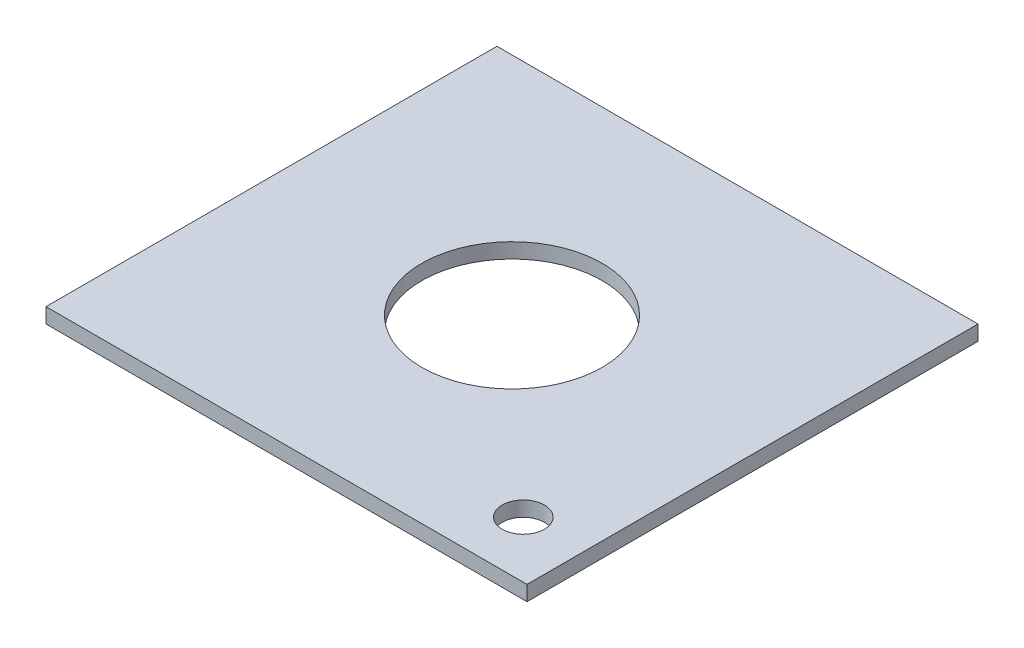
ISO-10303-21;
HEADER;
FILE_DESCRIPTION(('STEP AP214'),'2;1');
FILE_NAME('part.step','',(''),(''),'','','');
FILE_SCHEMA(('AUTOMOTIVE_DESIGN { 1 0 10303 214 1 1 1 1 }'));
ENDSEC;
DATA;
#1=APPLICATION_CONTEXT('core data for automotive mechanical design processes');
#2=APPLICATION_PROTOCOL_DEFINITION('international standard','automotive_design',2000,#1);
#3=PRODUCT_CONTEXT('',#1,'mechanical');
#4=PRODUCT('Part','Part','',(#3));
#5=PRODUCT_RELATED_PRODUCT_CATEGORY('part','',(#4));
#6=PRODUCT_DEFINITION_FORMATION('','',#4);
#7=PRODUCT_DEFINITION_CONTEXT('part definition',#1,'design');
#8=PRODUCT_DEFINITION('design','',#6,#7);
#9=PRODUCT_DEFINITION_SHAPE('','',#8);
#10=(LENGTH_UNIT() NAMED_UNIT(*) SI_UNIT(.MILLI.,.METRE.));
#11=(NAMED_UNIT(*) PLANE_ANGLE_UNIT() SI_UNIT($,.RADIAN.));
#12=(NAMED_UNIT(*) SI_UNIT($,.STERADIAN.) SOLID_ANGLE_UNIT());
#13=UNCERTAINTY_MEASURE_WITH_UNIT(LENGTH_MEASURE(1.E-05),#10,'distance_accuracy_value','');
#14=(GEOMETRIC_REPRESENTATION_CONTEXT(3) GLOBAL_UNCERTAINTY_ASSIGNED_CONTEXT((#13)) GLOBAL_UNIT_ASSIGNED_CONTEXT((#10,
#11,#12)) REPRESENTATION_CONTEXT('',''));
#15=CARTESIAN_POINT('',(0.,0.,0.));
#16=DIRECTION('',(0.,0.,1.));
#17=DIRECTION('',(1.,0.,0.));
#18=AXIS2_PLACEMENT_3D('',#15,#16,#17);
#19=CARTESIAN_POINT('',(0.,2.5,0.));
#20=DIRECTION('',(0.,1.,0.));
#21=DIRECTION('',(0.,0.,1.));
#22=AXIS2_PLACEMENT_3D('',#19,#20,#21);
#23=PLANE('',#22);
#24=CARTESIAN_POINT('',(0.,2.5,0.));
#25=DIRECTION('',(0.,1.,0.));
#26=DIRECTION('',(0.,0.,1.));
#27=AXIS2_PLACEMENT_3D('',#24,#25,#26);
#28=CIRCLE('',#27,15.);
#29=CARTESIAN_POINT('',(0.,2.5,15.));
#30=VERTEX_POINT('',#29);
#31=EDGE_CURVE('E100',#30,#30,#28,.T.);
#32=ORIENTED_EDGE('',*,*,#31,.F.);
#33=EDGE_LOOP('',(#32));
#34=FACE_BOUND('',#33,.T.);
#35=DIRECTION('',(0.,0.,-1.));
#36=VECTOR('',#35,1.);
#37=CARTESIAN_POINT('',(40.,2.5,-37.5));
#38=LINE('',#37,#36);
#39=CARTESIAN_POINT('',(40.,2.5,37.5));
#40=VERTEX_POINT('',#39);
#41=CARTESIAN_POINT('',(40.,2.5,-37.5));
#42=VERTEX_POINT('',#41);
#43=EDGE_CURVE('E85',#40,#42,#38,.T.);
#44=ORIENTED_EDGE('',*,*,#43,.T.);
#45=DIRECTION('',(-1.,0.,0.));
#46=VECTOR('',#45,1.);
#47=CARTESIAN_POINT('',(-40.,2.5,-37.5));
#48=LINE('',#47,#46);
#49=CARTESIAN_POINT('',(-40.,2.5,-37.5));
#50=VERTEX_POINT('',#49);
#51=EDGE_CURVE('E80',#42,#50,#48,.T.);
#52=ORIENTED_EDGE('',*,*,#51,.T.);
#53=DIRECTION('',(0.,0.,1.));
#54=VECTOR('',#53,1.);
#55=CARTESIAN_POINT('',(-40.,2.5,-37.5));
#56=LINE('',#55,#54);
#57=CARTESIAN_POINT('',(-40.,2.5,37.5));
#58=VERTEX_POINT('',#57);
#59=EDGE_CURVE('E83',#50,#58,#56,.T.);
#60=ORIENTED_EDGE('',*,*,#59,.T.);
#61=DIRECTION('',(1.,0.,0.));
#62=VECTOR('',#61,1.);
#63=CARTESIAN_POINT('',(-40.,2.5,37.5));
#64=LINE('',#63,#62);
#65=EDGE_CURVE('E50',#58,#40,#64,.T.);
#66=ORIENTED_EDGE('',*,*,#65,.T.);
#67=EDGE_LOOP('',(#44,#52,#60,#66));
#68=FACE_BOUND('',#67,.T.);
#69=CARTESIAN_POINT('',(30.,2.5,28.125));
#70=DIRECTION('',(0.,1.,0.));
#71=DIRECTION('',(0.,0.,1.));
#72=AXIS2_PLACEMENT_3D('',#69,#70,#71);
#73=CIRCLE('',#72,3.5);
#74=CARTESIAN_POINT('',(30.,2.5,31.625));
#75=VERTEX_POINT('',#74);
#76=EDGE_CURVE('E115',#75,#75,#73,.T.);
#77=ORIENTED_EDGE('',*,*,#76,.F.);
#78=EDGE_LOOP('',(#77));
#79=FACE_BOUND('',#78,.T.);
#80=ADVANCED_FACE('F33',(#34,#68,#79),#23,.T.);
#81=CARTESIAN_POINT('',(0.,0.,0.));
#82=DIRECTION('',(0.,1.,0.));
#83=DIRECTION('',(0.,0.,1.));
#84=AXIS2_PLACEMENT_3D('',#81,#82,#83);
#85=PLANE('',#84);
#86=DIRECTION('',(0.,0.,-1.));
#87=VECTOR('',#86,1.);
#88=CARTESIAN_POINT('',(40.,0.,-37.5));
#89=LINE('',#88,#87);
#90=CARTESIAN_POINT('',(40.,0.,37.5));
#91=VERTEX_POINT('',#90);
#92=CARTESIAN_POINT('',(40.,0.,-37.5));
#93=VERTEX_POINT('',#92);
#94=EDGE_CURVE('E97',#91,#93,#89,.T.);
#95=ORIENTED_EDGE('',*,*,#94,.F.);
#96=DIRECTION('',(1.,0.,0.));
#97=VECTOR('',#96,1.);
#98=CARTESIAN_POINT('',(-40.,0.,37.5));
#99=LINE('',#98,#97);
#100=CARTESIAN_POINT('',(-40.,0.,37.5));
#101=VERTEX_POINT('',#100);
#102=EDGE_CURVE('E73',#101,#91,#99,.T.);
#103=ORIENTED_EDGE('',*,*,#102,.F.);
#104=DIRECTION('',(0.,0.,1.));
#105=VECTOR('',#104,1.);
#106=CARTESIAN_POINT('',(-40.,0.,-37.5));
#107=LINE('',#106,#105);
#108=CARTESIAN_POINT('',(-40.,0.,-37.5));
#109=VERTEX_POINT('',#108);
#110=EDGE_CURVE('E67',#109,#101,#107,.T.);
#111=ORIENTED_EDGE('',*,*,#110,.F.);
#112=DIRECTION('',(-1.,0.,0.));
#113=VECTOR('',#112,1.);
#114=CARTESIAN_POINT('',(-40.,0.,-37.5));
#115=LINE('',#114,#113);
#116=EDGE_CURVE('E89',#93,#109,#115,.T.);
#117=ORIENTED_EDGE('',*,*,#116,.F.);
#118=EDGE_LOOP('',(#95,#103,#111,#117));
#119=FACE_BOUND('',#118,.T.);
#120=CARTESIAN_POINT('',(0.,0.,0.));
#121=DIRECTION('',(0.,1.,0.));
#122=DIRECTION('',(0.,0.,1.));
#123=AXIS2_PLACEMENT_3D('',#120,#121,#122);
#124=CIRCLE('',#123,15.);
#125=CARTESIAN_POINT('',(0.,0.,15.));
#126=VERTEX_POINT('',#125);
#127=EDGE_CURVE('E112',#126,#126,#124,.T.);
#128=ORIENTED_EDGE('',*,*,#127,.T.);
#129=EDGE_LOOP('',(#128));
#130=FACE_BOUND('',#129,.T.);
#131=CARTESIAN_POINT('',(30.,0.,28.125));
#132=DIRECTION('',(0.,1.,0.));
#133=DIRECTION('',(0.,0.,1.));
#134=AXIS2_PLACEMENT_3D('',#131,#132,#133);
#135=CIRCLE('',#134,3.5);
#136=CARTESIAN_POINT('',(30.,0.,31.625));
#137=VERTEX_POINT('',#136);
#138=EDGE_CURVE('E118',#137,#137,#135,.T.);
#139=ORIENTED_EDGE('',*,*,#138,.T.);
#140=EDGE_LOOP('',(#139));
#141=FACE_BOUND('',#140,.T.);
#142=ADVANCED_FACE('F108',(#119,#130,#141),#85,.F.);
#143=CARTESIAN_POINT('',(40.,2.5,-37.5));
#144=DIRECTION('',(-1.,0.,0.));
#145=DIRECTION('',(0.,0.,1.));
#146=AXIS2_PLACEMENT_3D('',#143,#144,#145);
#147=PLANE('',#146);
#148=ORIENTED_EDGE('',*,*,#94,.T.);
#149=DIRECTION('',(0.,-1.,0.));
#150=VECTOR('',#149,1.);
#151=CARTESIAN_POINT('',(40.,2.5,-37.5));
#152=LINE('',#151,#150);
#153=EDGE_CURVE('E11',#42,#93,#152,.T.);
#154=ORIENTED_EDGE('',*,*,#153,.F.);
#155=ORIENTED_EDGE('',*,*,#43,.F.);
#156=DIRECTION('',(0.,-1.,0.));
#157=VECTOR('',#156,1.);
#158=CARTESIAN_POINT('',(40.,2.5,37.5));
#159=LINE('',#158,#157);
#160=EDGE_CURVE('E93',#40,#91,#159,.T.);
#161=ORIENTED_EDGE('',*,*,#160,.T.);
#162=EDGE_LOOP('',(#148,#154,#155,#161));
#163=FACE_BOUND('',#162,.T.);
#164=ADVANCED_FACE('F35',(#163),#147,.F.);
#165=CARTESIAN_POINT('',(-40.,2.5,-37.5));
#166=DIRECTION('',(0.,0.,1.));
#167=DIRECTION('',(1.,0.,0.));
#168=AXIS2_PLACEMENT_3D('',#165,#166,#167);
#169=PLANE('',#168);
#170=ORIENTED_EDGE('',*,*,#116,.T.);
#171=DIRECTION('',(0.,-1.,0.));
#172=VECTOR('',#171,1.);
#173=CARTESIAN_POINT('',(-40.,2.5,-37.5));
#174=LINE('',#173,#172);
#175=EDGE_CURVE('E42',#50,#109,#174,.T.);
#176=ORIENTED_EDGE('',*,*,#175,.F.);
#177=ORIENTED_EDGE('',*,*,#51,.F.);
#178=ORIENTED_EDGE('',*,*,#153,.T.);
#179=EDGE_LOOP('',(#170,#176,#177,#178));
#180=FACE_BOUND('',#179,.T.);
#181=ADVANCED_FACE('F88',(#180),#169,.F.);
#182=CARTESIAN_POINT('',(-40.,2.5,-37.5));
#183=DIRECTION('',(1.,0.,0.));
#184=DIRECTION('',(0.,0.,-1.));
#185=AXIS2_PLACEMENT_3D('',#182,#183,#184);
#186=PLANE('',#185);
#187=ORIENTED_EDGE('',*,*,#110,.T.);
#188=DIRECTION('',(0.,-1.,0.));
#189=VECTOR('',#188,1.);
#190=CARTESIAN_POINT('',(-40.,2.5,37.5));
#191=LINE('',#190,#189);
#192=EDGE_CURVE('E90',#58,#101,#191,.T.);
#193=ORIENTED_EDGE('',*,*,#192,.F.);
#194=ORIENTED_EDGE('',*,*,#59,.F.);
#195=ORIENTED_EDGE('',*,*,#175,.T.);
#196=EDGE_LOOP('',(#187,#193,#194,#195));
#197=FACE_BOUND('',#196,.T.);
#198=ADVANCED_FACE('F91',(#197),#186,.F.);
#199=CARTESIAN_POINT('',(-40.,2.5,37.5));
#200=DIRECTION('',(0.,0.,-1.));
#201=DIRECTION('',(-1.,0.,0.));
#202=AXIS2_PLACEMENT_3D('',#199,#200,#201);
#203=PLANE('',#202);
#204=ORIENTED_EDGE('',*,*,#102,.T.);
#205=ORIENTED_EDGE('',*,*,#160,.F.);
#206=ORIENTED_EDGE('',*,*,#65,.F.);
#207=ORIENTED_EDGE('',*,*,#192,.T.);
#208=EDGE_LOOP('',(#204,#205,#206,#207));
#209=FACE_BOUND('',#208,.T.);
#210=ADVANCED_FACE('F105',(#209),#203,.F.);
#211=CARTESIAN_POINT('',(0.,2.5,0.));
#212=DIRECTION('',(0.,-1.,0.));
#213=DIRECTION('',(0.,0.,-1.));
#214=AXIS2_PLACEMENT_3D('',#211,#212,#213);
#215=CYLINDRICAL_SURFACE('',#214,15.);
#216=ORIENTED_EDGE('',*,*,#31,.T.);
#217=EDGE_LOOP('',(#216));
#218=FACE_BOUND('',#217,.T.);
#219=ORIENTED_EDGE('',*,*,#127,.F.);
#220=EDGE_LOOP('',(#219));
#221=FACE_BOUND('',#220,.T.);
#222=ADVANCED_FACE('F135',(#218,#221),#215,.F.);
#223=CARTESIAN_POINT('',(30.,2.5,28.125));
#224=DIRECTION('',(0.,-1.,0.));
#225=DIRECTION('',(0.,0.,-1.));
#226=AXIS2_PLACEMENT_3D('',#223,#224,#225);
#227=CYLINDRICAL_SURFACE('',#226,3.5);
#228=ORIENTED_EDGE('',*,*,#76,.T.);
#229=EDGE_LOOP('',(#228));
#230=FACE_BOUND('',#229,.T.);
#231=ORIENTED_EDGE('',*,*,#138,.F.);
#232=EDGE_LOOP('',(#231));
#233=FACE_BOUND('',#232,.T.);
#234=ADVANCED_FACE('F124',(#230,#233),#227,.F.);
#235=CLOSED_SHELL('',(#80,#142,#164,#181,#198,#210,#222,#234));
#236=MANIFOLD_SOLID_BREP('B2',#235);
#237=ADVANCED_BREP_SHAPE_REPRESENTATION('',(#18,#236),#14);
#238=SHAPE_DEFINITION_REPRESENTATION(#9,#237);
ENDSEC;
END-ISO-10303-21;
